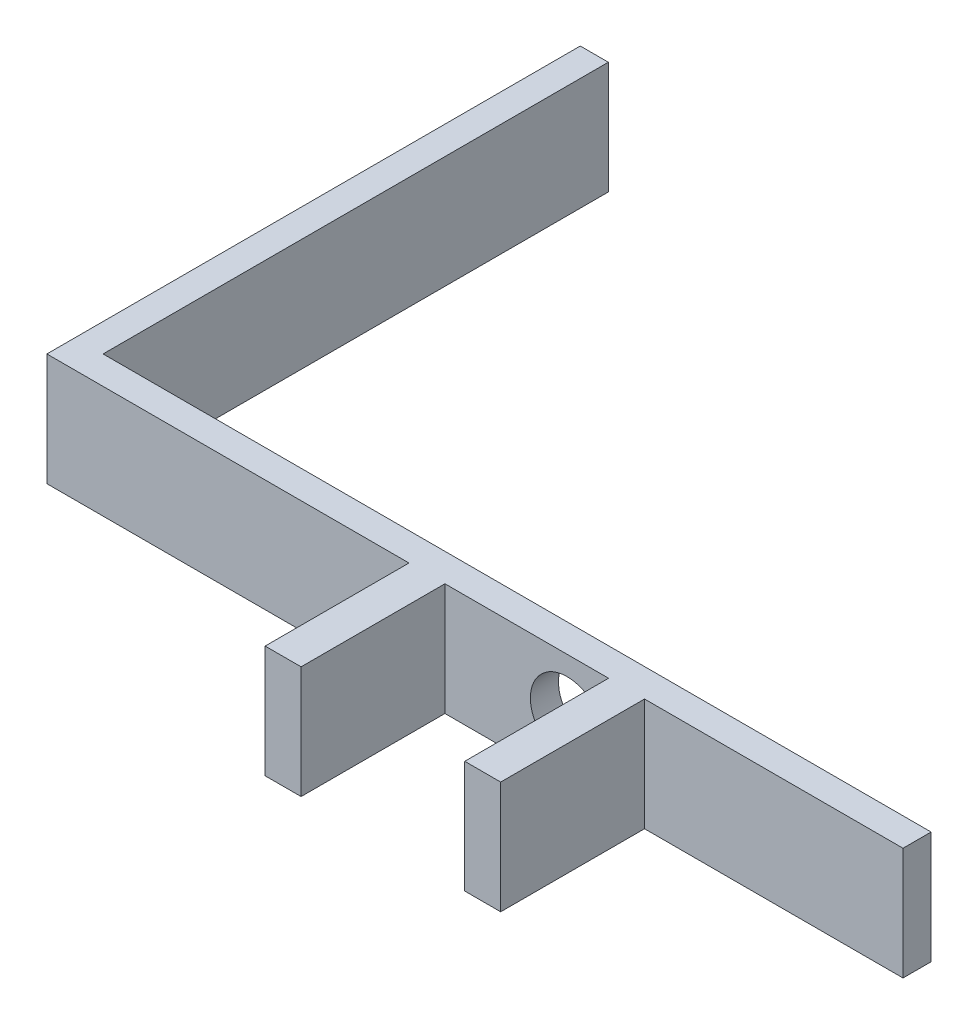
ISO-10303-21;
HEADER;
FILE_DESCRIPTION(('STEP AP214'),'2;1');
FILE_NAME('part.step','',(''),(''),'','','');
FILE_SCHEMA(('AUTOMOTIVE_DESIGN { 1 0 10303 214 1 1 1 1 }'));
ENDSEC;
DATA;
#1=APPLICATION_CONTEXT('core data for automotive mechanical design processes');
#2=APPLICATION_PROTOCOL_DEFINITION('international standard','automotive_design',2000,#1);
#3=PRODUCT_CONTEXT('',#1,'mechanical');
#4=PRODUCT('Part','Part','',(#3));
#5=PRODUCT_RELATED_PRODUCT_CATEGORY('part','',(#4));
#6=PRODUCT_DEFINITION_FORMATION('','',#4);
#7=PRODUCT_DEFINITION_CONTEXT('part definition',#1,'design');
#8=PRODUCT_DEFINITION('design','',#6,#7);
#9=PRODUCT_DEFINITION_SHAPE('','',#8);
#10=(LENGTH_UNIT() NAMED_UNIT(*) SI_UNIT(.MILLI.,.METRE.));
#11=(NAMED_UNIT(*) PLANE_ANGLE_UNIT() SI_UNIT($,.RADIAN.));
#12=(NAMED_UNIT(*) SI_UNIT($,.STERADIAN.) SOLID_ANGLE_UNIT());
#13=UNCERTAINTY_MEASURE_WITH_UNIT(LENGTH_MEASURE(1.E-05),#10,'distance_accuracy_value','');
#14=(GEOMETRIC_REPRESENTATION_CONTEXT(3) GLOBAL_UNCERTAINTY_ASSIGNED_CONTEXT((#13)) GLOBAL_UNIT_ASSIGNED_CONTEXT((#10,
#11,#12)) REPRESENTATION_CONTEXT('',''));
#15=CARTESIAN_POINT('',(0.,0.,0.));
#16=DIRECTION('',(0.,0.,1.));
#17=DIRECTION('',(1.,0.,0.));
#18=AXIS2_PLACEMENT_3D('',#15,#16,#17);
#19=CARTESIAN_POINT('',(3.96875,7.9375,0.));
#20=DIRECTION('',(0.,0.,-1.));
#21=DIRECTION('',(-1.,0.,0.));
#22=AXIS2_PLACEMENT_3D('',#19,#20,#21);
#23=PLANE('',#22);
#24=CARTESIAN_POINT('',(73.50125,0.,0.));
#25=DIRECTION('',(0.,0.,1.));
#26=DIRECTION('',(1.,0.,0.));
#27=AXIS2_PLACEMENT_3D('',#24,#25,#26);
#28=CIRCLE('',#27,5.20700000000001);
#29=CARTESIAN_POINT('',(78.70825,0.,0.));
#30=VERTEX_POINT('',#29);
#31=EDGE_CURVE('E214',#30,#30,#28,.T.);
#32=ORIENTED_EDGE('',*,*,#31,.F.);
#33=EDGE_LOOP('',(#32));
#34=FACE_BOUND('',#33,.T.);
#35=DIRECTION('',(0.,-1.,0.));
#36=VECTOR('',#35,1.);
#37=CARTESIAN_POINT('',(79.34325,7.9375,0.));
#38=LINE('',#37,#36);
#39=CARTESIAN_POINT('',(79.34325,7.9375,0.));
#40=VERTEX_POINT('',#39);
#41=CARTESIAN_POINT('',(79.34325,-7.9375,0.));
#42=VERTEX_POINT('',#41);
#43=EDGE_CURVE('E65',#40,#42,#38,.T.);
#44=ORIENTED_EDGE('',*,*,#43,.F.);
#45=DIRECTION('',(1.,0.,0.));
#46=VECTOR('',#45,1.);
#47=CARTESIAN_POINT('',(0.,7.9375,0.));
#48=LINE('',#47,#46);
#49=CARTESIAN_POINT('',(56.22925,7.9375,0.));
#50=VERTEX_POINT('',#49);
#51=EDGE_CURVE('E233',#50,#40,#48,.T.);
#52=ORIENTED_EDGE('',*,*,#51,.F.);
#53=DIRECTION('',(0.,1.,0.));
#54=VECTOR('',#53,1.);
#55=CARTESIAN_POINT('',(56.22925,7.9375,0.));
#56=LINE('',#55,#54);
#57=CARTESIAN_POINT('',(56.22925,-7.9375,0.));
#58=VERTEX_POINT('',#57);
#59=EDGE_CURVE('E176',#58,#50,#56,.T.);
#60=ORIENTED_EDGE('',*,*,#59,.F.);
#61=DIRECTION('',(1.,0.,0.));
#62=VECTOR('',#61,1.);
#63=CARTESIAN_POINT('',(3.96875,-7.9375,0.));
#64=LINE('',#63,#62);
#65=EDGE_CURVE('E254',#58,#42,#64,.T.);
#66=ORIENTED_EDGE('',*,*,#65,.T.);
#67=EDGE_LOOP('',(#44,#52,#60,#66));
#68=FACE_BOUND('',#67,.T.);
#69=ADVANCED_FACE('F41',(#34,#68),#23,.F.);
#70=DIRECTION('',(0.,1.,0.));
#71=VECTOR('',#70,1.);
#72=CARTESIAN_POINT('',(84.42325,7.9375,0.));
#73=LINE('',#72,#71);
#74=CARTESIAN_POINT('',(84.42325,-7.9375,0.));
#75=VERTEX_POINT('',#74);
#76=CARTESIAN_POINT('',(84.42325,7.9375,0.));
#77=VERTEX_POINT('',#76);
#78=EDGE_CURVE('E167',#75,#77,#73,.T.);
#79=ORIENTED_EDGE('',*,*,#78,.F.);
#80=CARTESIAN_POINT('',(120.93575,-7.9375,0.));
#81=VERTEX_POINT('',#80);
#82=EDGE_CURVE('E249',#75,#81,#64,.T.);
#83=ORIENTED_EDGE('',*,*,#82,.T.);
#84=DIRECTION('',(0.,-1.,0.));
#85=VECTOR('',#84,1.);
#86=CARTESIAN_POINT('',(120.93575,7.9375,0.));
#87=LINE('',#86,#85);
#88=CARTESIAN_POINT('',(120.93575,7.9375,0.));
#89=VERTEX_POINT('',#88);
#90=EDGE_CURVE('E50',#89,#81,#87,.T.);
#91=ORIENTED_EDGE('',*,*,#90,.F.);
#92=EDGE_CURVE('E57',#77,#89,#48,.T.);
#93=ORIENTED_EDGE('',*,*,#92,.F.);
#94=EDGE_LOOP('',(#79,#83,#91,#93));
#95=FACE_BOUND('',#94,.T.);
#96=ADVANCED_FACE('F321',(#95),#23,.F.);
#97=DIRECTION('',(0.,-1.,0.));
#98=VECTOR('',#97,1.);
#99=CARTESIAN_POINT('',(51.14925,7.9375,0.));
#100=LINE('',#99,#98);
#101=CARTESIAN_POINT('',(51.14925,7.9375,0.));
#102=VERTEX_POINT('',#101);
#103=CARTESIAN_POINT('',(51.14925,-7.9375,0.));
#104=VERTEX_POINT('',#103);
#105=EDGE_CURVE('E171',#102,#104,#100,.T.);
#106=ORIENTED_EDGE('',*,*,#105,.F.);
#107=CARTESIAN_POINT('',(0.,7.9375,0.));
#108=VERTEX_POINT('',#107);
#109=EDGE_CURVE('E228',#108,#102,#48,.T.);
#110=ORIENTED_EDGE('',*,*,#109,.F.);
#111=DIRECTION('',(0.,-1.,0.));
#112=VECTOR('',#111,1.);
#113=CARTESIAN_POINT('',(0.,7.9375,0.));
#114=LINE('',#113,#112);
#115=CARTESIAN_POINT('',(0.,-7.9375,0.));
#116=VERTEX_POINT('',#115);
#117=EDGE_CURVE('E11',#108,#116,#114,.T.);
#118=ORIENTED_EDGE('',*,*,#117,.T.);
#119=EDGE_CURVE('E250',#116,#104,#64,.T.);
#120=ORIENTED_EDGE('',*,*,#119,.T.);
#121=EDGE_LOOP('',(#106,#110,#118,#120));
#122=FACE_BOUND('',#121,.T.);
#123=ADVANCED_FACE('F336',(#122),#23,.F.);
#124=CARTESIAN_POINT('',(0.,7.9375,0.));
#125=DIRECTION('',(1.,0.,0.));
#126=DIRECTION('',(0.,0.,-1.));
#127=AXIS2_PLACEMENT_3D('',#124,#125,#126);
#128=PLANE('',#127);
#129=DIRECTION('',(0.,0.,1.));
#130=VECTOR('',#129,1.);
#131=CARTESIAN_POINT('',(0.,-7.9375,0.));
#132=LINE('',#131,#130);
#133=CARTESIAN_POINT('',(0.,-7.9375,-75.34275));
#134=VERTEX_POINT('',#133);
#135=EDGE_CURVE('E222',#134,#116,#132,.T.);
#136=ORIENTED_EDGE('',*,*,#135,.T.);
#137=ORIENTED_EDGE('',*,*,#117,.F.);
#138=DIRECTION('',(0.,0.,1.));
#139=VECTOR('',#138,1.);
#140=CARTESIAN_POINT('',(0.,7.9375,0.));
#141=LINE('',#140,#139);
#142=CARTESIAN_POINT('',(0.,7.9375,-75.34275));
#143=VERTEX_POINT('',#142);
#144=EDGE_CURVE('E223',#143,#108,#141,.T.);
#145=ORIENTED_EDGE('',*,*,#144,.F.);
#146=DIRECTION('',(0.,-1.,0.));
#147=VECTOR('',#146,1.);
#148=CARTESIAN_POINT('',(0.,7.9375,-75.34275));
#149=LINE('',#148,#147);
#150=EDGE_CURVE('E245',#143,#134,#149,.T.);
#151=ORIENTED_EDGE('',*,*,#150,.T.);
#152=EDGE_LOOP('',(#136,#137,#145,#151));
#153=FACE_BOUND('',#152,.T.);
#154=ADVANCED_FACE('F43',(#153),#128,.F.);
#155=CARTESIAN_POINT('',(120.93575,7.9375,0.));
#156=DIRECTION('',(-1.,0.,0.));
#157=DIRECTION('',(0.,0.,1.));
#158=AXIS2_PLACEMENT_3D('',#155,#156,#157);
#159=PLANE('',#158);
#160=DIRECTION('',(0.,0.,-1.));
#161=VECTOR('',#160,1.);
#162=CARTESIAN_POINT('',(120.93575,-7.9375,0.));
#163=LINE('',#162,#161);
#164=CARTESIAN_POINT('',(120.93575,-7.9375,-3.96875000000001));
#165=VERTEX_POINT('',#164);
#166=EDGE_CURVE('E253',#81,#165,#163,.T.);
#167=ORIENTED_EDGE('',*,*,#166,.T.);
#168=DIRECTION('',(0.,-1.,0.));
#169=VECTOR('',#168,1.);
#170=CARTESIAN_POINT('',(120.93575,7.9375,-3.96875000000001));
#171=LINE('',#170,#169);
#172=CARTESIAN_POINT('',(120.93575,7.9375,-3.96875000000001));
#173=VERTEX_POINT('',#172);
#174=EDGE_CURVE('E276',#173,#165,#171,.T.);
#175=ORIENTED_EDGE('',*,*,#174,.F.);
#176=DIRECTION('',(0.,0.,-1.));
#177=VECTOR('',#176,1.);
#178=CARTESIAN_POINT('',(120.93575,7.9375,0.));
#179=LINE('',#178,#177);
#180=EDGE_CURVE('E232',#89,#173,#179,.T.);
#181=ORIENTED_EDGE('',*,*,#180,.F.);
#182=ORIENTED_EDGE('',*,*,#90,.T.);
#183=EDGE_LOOP('',(#167,#175,#181,#182));
#184=FACE_BOUND('',#183,.T.);
#185=ADVANCED_FACE('F284',(#184),#159,.F.);
#186=CARTESIAN_POINT('',(3.96875,7.9375,-3.96875));
#187=DIRECTION('',(0.,0.,1.));
#188=DIRECTION('',(1.,0.,0.));
#189=AXIS2_PLACEMENT_3D('',#186,#187,#188);
#190=PLANE('',#189);
#191=CARTESIAN_POINT('',(73.50125,0.,-3.96875000000001));
#192=DIRECTION('',(0.,0.,1.));
#193=DIRECTION('',(1.,0.,0.));
#194=AXIS2_PLACEMENT_3D('',#191,#192,#193);
#195=CIRCLE('',#194,5.20700000000001);
#196=CARTESIAN_POINT('',(78.70825,0.,-3.96875000000001));
#197=VERTEX_POINT('',#196);
#198=EDGE_CURVE('E218',#197,#197,#195,.F.);
#199=ORIENTED_EDGE('',*,*,#198,.F.);
#200=EDGE_LOOP('',(#199));
#201=FACE_BOUND('',#200,.T.);
#202=DIRECTION('',(-1.,0.,0.));
#203=VECTOR('',#202,1.);
#204=CARTESIAN_POINT('',(3.96875,-7.9375,-3.96875));
#205=LINE('',#204,#203);
#206=CARTESIAN_POINT('',(3.96875,-7.9375,-3.96875));
#207=VERTEX_POINT('',#206);
#208=EDGE_CURVE('E257',#165,#207,#205,.T.);
#209=ORIENTED_EDGE('',*,*,#208,.T.);
#210=DIRECTION('',(0.,-1.,0.));
#211=VECTOR('',#210,1.);
#212=CARTESIAN_POINT('',(3.96875,7.9375,-3.96875));
#213=LINE('',#212,#211);
#214=CARTESIAN_POINT('',(3.96875,7.9375,-3.96875));
#215=VERTEX_POINT('',#214);
#216=EDGE_CURVE('E272',#215,#207,#213,.T.);
#217=ORIENTED_EDGE('',*,*,#216,.F.);
#218=DIRECTION('',(-1.,0.,0.));
#219=VECTOR('',#218,1.);
#220=CARTESIAN_POINT('',(3.96875,7.9375,-3.96875));
#221=LINE('',#220,#219);
#222=EDGE_CURVE('E236',#173,#215,#221,.T.);
#223=ORIENTED_EDGE('',*,*,#222,.F.);
#224=ORIENTED_EDGE('',*,*,#174,.T.);
#225=EDGE_LOOP('',(#209,#217,#223,#224));
#226=FACE_BOUND('',#225,.T.);
#227=ADVANCED_FACE('F291',(#201,#226),#190,.F.);
#228=CARTESIAN_POINT('',(3.96875,7.9375,-3.96875));
#229=DIRECTION('',(-1.,0.,0.));
#230=DIRECTION('',(0.,0.,1.));
#231=AXIS2_PLACEMENT_3D('',#228,#229,#230);
#232=PLANE('',#231);
#233=DIRECTION('',(0.,0.,-1.));
#234=VECTOR('',#233,1.);
#235=CARTESIAN_POINT('',(3.96875,-7.9375,-3.96875));
#236=LINE('',#235,#234);
#237=CARTESIAN_POINT('',(3.96875,-7.9375,-75.34275));
#238=VERTEX_POINT('',#237);
#239=EDGE_CURVE('E260',#207,#238,#236,.T.);
#240=ORIENTED_EDGE('',*,*,#239,.T.);
#241=DIRECTION('',(0.,-1.,0.));
#242=VECTOR('',#241,1.);
#243=CARTESIAN_POINT('',(3.96875,7.9375,-75.34275));
#244=LINE('',#243,#242);
#245=CARTESIAN_POINT('',(3.96875,7.9375,-75.34275));
#246=VERTEX_POINT('',#245);
#247=EDGE_CURVE('E268',#246,#238,#244,.T.);
#248=ORIENTED_EDGE('',*,*,#247,.F.);
#249=DIRECTION('',(0.,0.,-1.));
#250=VECTOR('',#249,1.);
#251=CARTESIAN_POINT('',(3.96875,7.9375,-3.96875));
#252=LINE('',#251,#250);
#253=EDGE_CURVE('E239',#215,#246,#252,.T.);
#254=ORIENTED_EDGE('',*,*,#253,.F.);
#255=ORIENTED_EDGE('',*,*,#216,.T.);
#256=EDGE_LOOP('',(#240,#248,#254,#255));
#257=FACE_BOUND('',#256,.T.);
#258=ADVANCED_FACE('F295',(#257),#232,.F.);
#259=CARTESIAN_POINT('',(0.,7.9375,-75.34275));
#260=DIRECTION('',(0.,0.,1.));
#261=DIRECTION('',(1.,0.,0.));
#262=AXIS2_PLACEMENT_3D('',#259,#260,#261);
#263=PLANE('',#262);
#264=DIRECTION('',(-1.,0.,0.));
#265=VECTOR('',#264,1.);
#266=CARTESIAN_POINT('',(0.,-7.9375,-75.34275));
#267=LINE('',#266,#265);
#268=EDGE_CURVE('E227',#238,#134,#267,.T.);
#269=ORIENTED_EDGE('',*,*,#268,.T.);
#270=ORIENTED_EDGE('',*,*,#150,.F.);
#271=DIRECTION('',(-1.,0.,0.));
#272=VECTOR('',#271,1.);
#273=CARTESIAN_POINT('',(0.,7.9375,-75.34275));
#274=LINE('',#273,#272);
#275=EDGE_CURVE('E242',#246,#143,#274,.T.);
#276=ORIENTED_EDGE('',*,*,#275,.F.);
#277=ORIENTED_EDGE('',*,*,#247,.T.);
#278=EDGE_LOOP('',(#269,#270,#276,#277));
#279=FACE_BOUND('',#278,.T.);
#280=ADVANCED_FACE('F341',(#279),#263,.F.);
#281=CARTESIAN_POINT('',(0.,7.9375,0.));
#282=DIRECTION('',(0.,-1.,0.));
#283=DIRECTION('',(0.,0.,-1.));
#284=AXIS2_PLACEMENT_3D('',#281,#282,#283);
#285=PLANE('',#284);
#286=ORIENTED_EDGE('',*,*,#144,.T.);
#287=ORIENTED_EDGE('',*,*,#109,.T.);
#288=DIRECTION('',(0.,0.,-1.));
#289=VECTOR('',#288,1.);
#290=CARTESIAN_POINT('',(51.14925,7.9375,20.32));
#291=LINE('',#290,#289);
#292=CARTESIAN_POINT('',(51.14925,7.9375,20.32));
#293=VERTEX_POINT('',#292);
#294=EDGE_CURVE('E194',#293,#102,#291,.T.);
#295=ORIENTED_EDGE('',*,*,#294,.F.);
#296=DIRECTION('',(-1.,0.,0.));
#297=VECTOR('',#296,1.);
#298=CARTESIAN_POINT('',(51.14925,7.9375,20.32));
#299=LINE('',#298,#297);
#300=CARTESIAN_POINT('',(56.22925,7.9375,20.32));
#301=VERTEX_POINT('',#300);
#302=EDGE_CURVE('E192',#301,#293,#299,.T.);
#303=ORIENTED_EDGE('',*,*,#302,.F.);
#304=DIRECTION('',(0.,0.,-1.));
#305=VECTOR('',#304,1.);
#306=CARTESIAN_POINT('',(56.22925,7.9375,20.32));
#307=LINE('',#306,#305);
#308=EDGE_CURVE('E202',#301,#50,#307,.T.);
#309=ORIENTED_EDGE('',*,*,#308,.T.);
#310=ORIENTED_EDGE('',*,*,#51,.T.);
#311=DIRECTION('',(0.,0.,-1.));
#312=VECTOR('',#311,1.);
#313=CARTESIAN_POINT('',(79.34325,7.9375,20.32));
#314=LINE('',#313,#312);
#315=CARTESIAN_POINT('',(79.34325,7.9375,20.32));
#316=VERTEX_POINT('',#315);
#317=EDGE_CURVE('E305',#316,#40,#314,.T.);
#318=ORIENTED_EDGE('',*,*,#317,.F.);
#319=DIRECTION('',(-1.,0.,0.));
#320=VECTOR('',#319,1.);
#321=CARTESIAN_POINT('',(79.34325,7.9375,20.32));
#322=LINE('',#321,#320);
#323=CARTESIAN_POINT('',(84.42325,7.9375,20.32));
#324=VERTEX_POINT('',#323);
#325=EDGE_CURVE('E162',#324,#316,#322,.T.);
#326=ORIENTED_EDGE('',*,*,#325,.F.);
#327=DIRECTION('',(0.,0.,-1.));
#328=VECTOR('',#327,1.);
#329=CARTESIAN_POINT('',(84.42325,7.9375,20.32));
#330=LINE('',#329,#328);
#331=EDGE_CURVE('E178',#324,#77,#330,.T.);
#332=ORIENTED_EDGE('',*,*,#331,.T.);
#333=ORIENTED_EDGE('',*,*,#92,.T.);
#334=ORIENTED_EDGE('',*,*,#180,.T.);
#335=ORIENTED_EDGE('',*,*,#222,.T.);
#336=ORIENTED_EDGE('',*,*,#253,.T.);
#337=ORIENTED_EDGE('',*,*,#275,.T.);
#338=EDGE_LOOP('',(#286,#287,#295,#303,#309,#310,#318,#326,#332,#333,#334,#335,#336,#337));
#339=FACE_BOUND('',#338,.T.);
#340=ADVANCED_FACE('F299',(#339),#285,.F.);
#341=CARTESIAN_POINT('',(0.,-7.9375,0.));
#342=DIRECTION('',(0.,-1.,0.));
#343=DIRECTION('',(0.,0.,-1.));
#344=AXIS2_PLACEMENT_3D('',#341,#342,#343);
#345=PLANE('',#344);
#346=ORIENTED_EDGE('',*,*,#135,.F.);
#347=ORIENTED_EDGE('',*,*,#268,.F.);
#348=ORIENTED_EDGE('',*,*,#239,.F.);
#349=ORIENTED_EDGE('',*,*,#208,.F.);
#350=ORIENTED_EDGE('',*,*,#166,.F.);
#351=ORIENTED_EDGE('',*,*,#82,.F.);
#352=DIRECTION('',(0.,0.,-1.));
#353=VECTOR('',#352,1.);
#354=CARTESIAN_POINT('',(84.42325,-7.9375,20.32));
#355=LINE('',#354,#353);
#356=CARTESIAN_POINT('',(84.42325,-7.9375,20.32));
#357=VERTEX_POINT('',#356);
#358=EDGE_CURVE('E152',#357,#75,#355,.T.);
#359=ORIENTED_EDGE('',*,*,#358,.F.);
#360=DIRECTION('',(1.,0.,0.));
#361=VECTOR('',#360,1.);
#362=CARTESIAN_POINT('',(79.34325,-7.9375,20.32));
#363=LINE('',#362,#361);
#364=CARTESIAN_POINT('',(79.34325,-7.9375,20.32));
#365=VERTEX_POINT('',#364);
#366=EDGE_CURVE('E144',#365,#357,#363,.T.);
#367=ORIENTED_EDGE('',*,*,#366,.F.);
#368=DIRECTION('',(0.,0.,-1.));
#369=VECTOR('',#368,1.);
#370=CARTESIAN_POINT('',(79.34325,-7.9375,20.32));
#371=LINE('',#370,#369);
#372=EDGE_CURVE('E150',#365,#42,#371,.T.);
#373=ORIENTED_EDGE('',*,*,#372,.T.);
#374=ORIENTED_EDGE('',*,*,#65,.F.);
#375=DIRECTION('',(0.,0.,-1.));
#376=VECTOR('',#375,1.);
#377=CARTESIAN_POINT('',(56.22925,-7.9375,20.32));
#378=LINE('',#377,#376);
#379=CARTESIAN_POINT('',(56.22925,-7.9375,20.32));
#380=VERTEX_POINT('',#379);
#381=EDGE_CURVE('E206',#380,#58,#378,.T.);
#382=ORIENTED_EDGE('',*,*,#381,.F.);
#383=DIRECTION('',(1.,0.,0.));
#384=VECTOR('',#383,1.);
#385=CARTESIAN_POINT('',(51.14925,-7.9375,20.32));
#386=LINE('',#385,#384);
#387=CARTESIAN_POINT('',(51.14925,-7.9375,20.32));
#388=VERTEX_POINT('',#387);
#389=EDGE_CURVE('E186',#388,#380,#386,.T.);
#390=ORIENTED_EDGE('',*,*,#389,.F.);
#391=DIRECTION('',(0.,0.,-1.));
#392=VECTOR('',#391,1.);
#393=CARTESIAN_POINT('',(51.14925,-7.9375,20.32));
#394=LINE('',#393,#392);
#395=EDGE_CURVE('E210',#388,#104,#394,.T.);
#396=ORIENTED_EDGE('',*,*,#395,.T.);
#397=ORIENTED_EDGE('',*,*,#119,.F.);
#398=EDGE_LOOP('',(#346,#347,#348,#349,#350,#351,#359,#367,#373,#374,#382,#390,#396,#397));
#399=FACE_BOUND('',#398,.T.);
#400=ADVANCED_FACE('F147',(#399),#345,.T.);
#401=CARTESIAN_POINT('',(73.50125,0.,-18.6963700385534));
#402=DIRECTION('',(0.,0.,1.));
#403=DIRECTION('',(1.,0.,0.));
#404=AXIS2_PLACEMENT_3D('',#401,#402,#403);
#405=CYLINDRICAL_SURFACE('',#404,5.20700000000001);
#406=ORIENTED_EDGE('',*,*,#198,.T.);
#407=EDGE_LOOP('',(#406));
#408=FACE_BOUND('',#407,.T.);
#409=ORIENTED_EDGE('',*,*,#31,.T.);
#410=EDGE_LOOP('',(#409));
#411=FACE_BOUND('',#410,.T.);
#412=ADVANCED_FACE('F374',(#408,#411),#405,.F.);
#413=CARTESIAN_POINT('',(51.14925,7.9375,20.32));
#414=DIRECTION('',(1.,0.,0.));
#415=DIRECTION('',(0.,0.,-1.));
#416=AXIS2_PLACEMENT_3D('',#413,#414,#415);
#417=PLANE('',#416);
#418=ORIENTED_EDGE('',*,*,#105,.T.);
#419=ORIENTED_EDGE('',*,*,#395,.F.);
#420=DIRECTION('',(0.,-1.,0.));
#421=VECTOR('',#420,1.);
#422=CARTESIAN_POINT('',(51.14925,7.9375,20.32));
#423=LINE('',#422,#421);
#424=EDGE_CURVE('E182',#293,#388,#423,.T.);
#425=ORIENTED_EDGE('',*,*,#424,.F.);
#426=ORIENTED_EDGE('',*,*,#294,.T.);
#427=EDGE_LOOP('',(#418,#419,#425,#426));
#428=FACE_BOUND('',#427,.T.);
#429=ADVANCED_FACE('F334',(#428),#417,.F.);
#430=CARTESIAN_POINT('',(56.22925,7.9375,20.32));
#431=DIRECTION('',(-1.,0.,0.));
#432=DIRECTION('',(0.,0.,1.));
#433=AXIS2_PLACEMENT_3D('',#430,#431,#432);
#434=PLANE('',#433);
#435=ORIENTED_EDGE('',*,*,#59,.T.);
#436=ORIENTED_EDGE('',*,*,#308,.F.);
#437=DIRECTION('',(0.,1.,0.));
#438=VECTOR('',#437,1.);
#439=CARTESIAN_POINT('',(56.22925,7.9375,20.32));
#440=LINE('',#439,#438);
#441=EDGE_CURVE('E189',#380,#301,#440,.T.);
#442=ORIENTED_EDGE('',*,*,#441,.F.);
#443=ORIENTED_EDGE('',*,*,#381,.T.);
#444=EDGE_LOOP('',(#435,#436,#442,#443));
#445=FACE_BOUND('',#444,.T.);
#446=ADVANCED_FACE('F327',(#445),#434,.F.);
#447=CARTESIAN_POINT('',(0.,0.,20.32));
#448=DIRECTION('',(0.,0.,1.));
#449=DIRECTION('',(1.,0.,0.));
#450=AXIS2_PLACEMENT_3D('',#447,#448,#449);
#451=PLANE('',#450);
#452=ORIENTED_EDGE('',*,*,#424,.T.);
#453=ORIENTED_EDGE('',*,*,#389,.T.);
#454=ORIENTED_EDGE('',*,*,#441,.T.);
#455=ORIENTED_EDGE('',*,*,#302,.T.);
#456=EDGE_LOOP('',(#452,#453,#454,#455));
#457=FACE_BOUND('',#456,.T.);
#458=ADVANCED_FACE('F329',(#457),#451,.T.);
#459=CARTESIAN_POINT('',(79.34325,7.9375,20.32));
#460=DIRECTION('',(1.,0.,0.));
#461=DIRECTION('',(0.,0.,-1.));
#462=AXIS2_PLACEMENT_3D('',#459,#460,#461);
#463=PLANE('',#462);
#464=ORIENTED_EDGE('',*,*,#43,.T.);
#465=ORIENTED_EDGE('',*,*,#372,.F.);
#466=DIRECTION('',(0.,-1.,0.));
#467=VECTOR('',#466,1.);
#468=CARTESIAN_POINT('',(79.34325,7.9375,20.32));
#469=LINE('',#468,#467);
#470=EDGE_CURVE('E157',#316,#365,#469,.T.);
#471=ORIENTED_EDGE('',*,*,#470,.F.);
#472=ORIENTED_EDGE('',*,*,#317,.T.);
#473=EDGE_LOOP('',(#464,#465,#471,#472));
#474=FACE_BOUND('',#473,.T.);
#475=ADVANCED_FACE('F169',(#474),#463,.F.);
#476=CARTESIAN_POINT('',(84.42325,7.9375,20.32));
#477=DIRECTION('',(-1.,0.,0.));
#478=DIRECTION('',(0.,0.,1.));
#479=AXIS2_PLACEMENT_3D('',#476,#477,#478);
#480=PLANE('',#479);
#481=ORIENTED_EDGE('',*,*,#78,.T.);
#482=ORIENTED_EDGE('',*,*,#331,.F.);
#483=DIRECTION('',(0.,1.,0.));
#484=VECTOR('',#483,1.);
#485=CARTESIAN_POINT('',(84.42325,7.9375,20.32));
#486=LINE('',#485,#484);
#487=EDGE_CURVE('E156',#357,#324,#486,.T.);
#488=ORIENTED_EDGE('',*,*,#487,.F.);
#489=ORIENTED_EDGE('',*,*,#358,.T.);
#490=EDGE_LOOP('',(#481,#482,#488,#489));
#491=FACE_BOUND('',#490,.T.);
#492=ADVANCED_FACE('F320',(#491),#480,.F.);
#493=CARTESIAN_POINT('',(0.,0.,20.32));
#494=DIRECTION('',(0.,0.,1.));
#495=DIRECTION('',(1.,0.,0.));
#496=AXIS2_PLACEMENT_3D('',#493,#494,#495);
#497=PLANE('',#496);
#498=ORIENTED_EDGE('',*,*,#470,.T.);
#499=ORIENTED_EDGE('',*,*,#366,.T.);
#500=ORIENTED_EDGE('',*,*,#487,.T.);
#501=ORIENTED_EDGE('',*,*,#325,.T.);
#502=EDGE_LOOP('',(#498,#499,#500,#501));
#503=FACE_BOUND('',#502,.T.);
#504=ADVANCED_FACE('F160',(#503),#497,.T.);
#505=CLOSED_SHELL('',(#69,#96,#123,#154,#185,#227,#258,#280,#340,#400,#412,#429,#446,#458,#475,
#492,#504));
#506=MANIFOLD_SOLID_BREP('B2',#505);
#507=ADVANCED_BREP_SHAPE_REPRESENTATION('',(#18,#506),#14);
#508=SHAPE_DEFINITION_REPRESENTATION(#9,#507);
ENDSEC;
END-ISO-10303-21;
